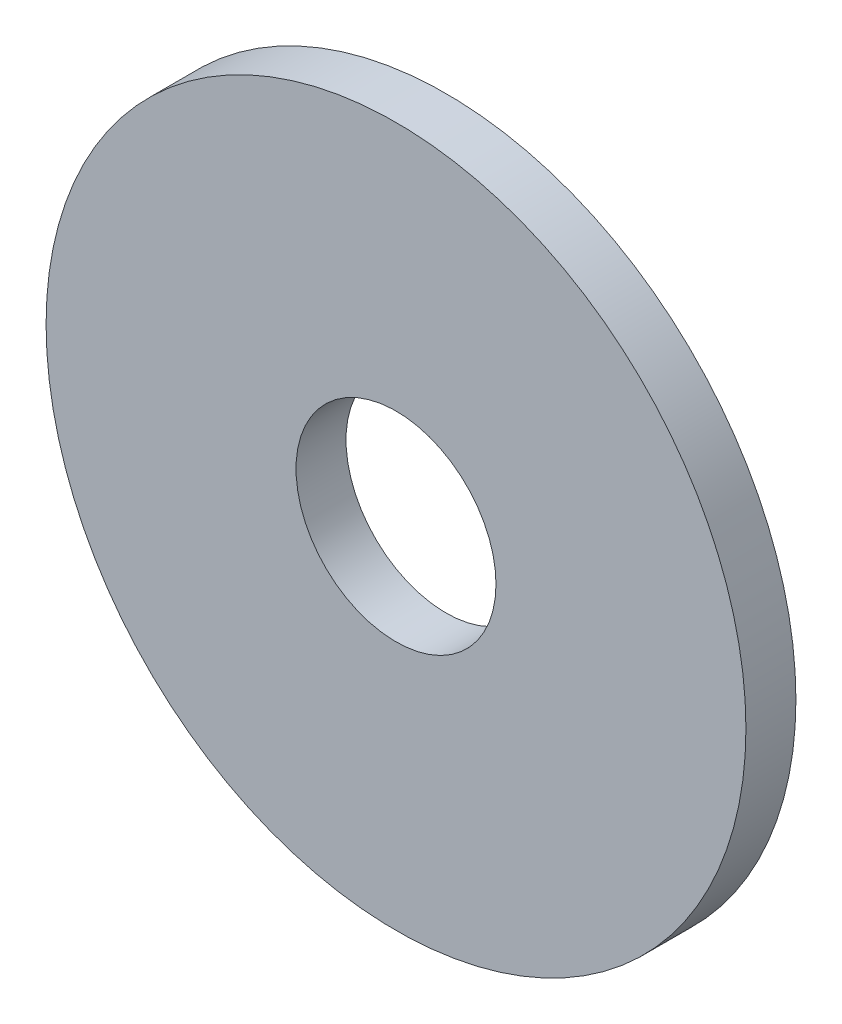
ISO-10303-21;
HEADER;
FILE_DESCRIPTION(('STEP AP214'),'2;1');
FILE_NAME('part.step','',(''),(''),'','','');
FILE_SCHEMA(('AUTOMOTIVE_DESIGN { 1 0 10303 214 1 1 1 1 }'));
ENDSEC;
DATA;
#1=APPLICATION_CONTEXT('core data for automotive mechanical design processes');
#2=APPLICATION_PROTOCOL_DEFINITION('international standard','automotive_design',2000,#1);
#3=PRODUCT_CONTEXT('',#1,'mechanical');
#4=PRODUCT('Part','Part','',(#3));
#5=PRODUCT_RELATED_PRODUCT_CATEGORY('part','',(#4));
#6=PRODUCT_DEFINITION_FORMATION('','',#4);
#7=PRODUCT_DEFINITION_CONTEXT('part definition',#1,'design');
#8=PRODUCT_DEFINITION('design','',#6,#7);
#9=PRODUCT_DEFINITION_SHAPE('','',#8);
#10=(LENGTH_UNIT() NAMED_UNIT(*) SI_UNIT(.MILLI.,.METRE.));
#11=(NAMED_UNIT(*) PLANE_ANGLE_UNIT() SI_UNIT($,.RADIAN.));
#12=(NAMED_UNIT(*) SI_UNIT($,.STERADIAN.) SOLID_ANGLE_UNIT());
#13=UNCERTAINTY_MEASURE_WITH_UNIT(LENGTH_MEASURE(1.E-05),#10,'distance_accuracy_value','');
#14=(GEOMETRIC_REPRESENTATION_CONTEXT(3) GLOBAL_UNCERTAINTY_ASSIGNED_CONTEXT((#13)) GLOBAL_UNIT_ASSIGNED_CONTEXT((#10,
#11,#12)) REPRESENTATION_CONTEXT('',''));
#15=CARTESIAN_POINT('',(0.,0.,0.));
#16=DIRECTION('',(0.,0.,1.));
#17=DIRECTION('',(1.,0.,0.));
#18=AXIS2_PLACEMENT_3D('',#15,#16,#17);
#19=CARTESIAN_POINT('',(0.,0.,1.));
#20=DIRECTION('',(0.,0.,1.));
#21=DIRECTION('',(1.,0.,0.));
#22=AXIS2_PLACEMENT_3D('',#19,#20,#21);
#23=PLANE('',#22);
#24=CARTESIAN_POINT('',(0.,0.,1.));
#25=DIRECTION('',(0.,0.,1.));
#26=DIRECTION('',(1.,0.,0.));
#27=AXIS2_PLACEMENT_3D('',#24,#25,#26);
#28=CIRCLE('',#27,7.);
#29=CARTESIAN_POINT('',(7.,0.,1.));
#30=VERTEX_POINT('',#29);
#31=EDGE_CURVE('E10',#30,#30,#28,.T.);
#32=ORIENTED_EDGE('',*,*,#31,.T.);
#33=EDGE_LOOP('',(#32));
#34=FACE_BOUND('',#33,.T.);
#35=CARTESIAN_POINT('',(0.,0.,1.));
#36=DIRECTION('',(0.,0.,1.));
#37=DIRECTION('',(1.,0.,0.));
#38=AXIS2_PLACEMENT_3D('',#35,#36,#37);
#39=CIRCLE('',#38,2.);
#40=CARTESIAN_POINT('',(2.,0.,1.));
#41=VERTEX_POINT('',#40);
#42=EDGE_CURVE('E42',#41,#41,#39,.T.);
#43=ORIENTED_EDGE('',*,*,#42,.F.);
#44=EDGE_LOOP('',(#43));
#45=FACE_BOUND('',#44,.T.);
#46=ADVANCED_FACE('F31',(#34,#45),#23,.T.);
#47=CARTESIAN_POINT('',(0.,0.,0.));
#48=DIRECTION('',(0.,0.,1.));
#49=DIRECTION('',(1.,0.,0.));
#50=AXIS2_PLACEMENT_3D('',#47,#48,#49);
#51=PLANE('',#50);
#52=CARTESIAN_POINT('',(0.,0.,0.));
#53=DIRECTION('',(0.,0.,1.));
#54=DIRECTION('',(1.,0.,0.));
#55=AXIS2_PLACEMENT_3D('',#52,#53,#54);
#56=CIRCLE('',#55,7.);
#57=CARTESIAN_POINT('',(7.,0.,0.));
#58=VERTEX_POINT('',#57);
#59=EDGE_CURVE('E35',#58,#58,#56,.T.);
#60=ORIENTED_EDGE('',*,*,#59,.F.);
#61=EDGE_LOOP('',(#60));
#62=FACE_BOUND('',#61,.T.);
#63=CARTESIAN_POINT('',(0.,0.,0.));
#64=DIRECTION('',(0.,0.,1.));
#65=DIRECTION('',(1.,0.,0.));
#66=AXIS2_PLACEMENT_3D('',#63,#64,#65);
#67=CIRCLE('',#66,2.);
#68=CARTESIAN_POINT('',(2.,0.,0.));
#69=VERTEX_POINT('',#68);
#70=EDGE_CURVE('E44',#69,#69,#67,.T.);
#71=ORIENTED_EDGE('',*,*,#70,.T.);
#72=EDGE_LOOP('',(#71));
#73=FACE_BOUND('',#72,.T.);
#74=ADVANCED_FACE('F54',(#62,#73),#51,.F.);
#75=CARTESIAN_POINT('',(0.,0.,1.));
#76=DIRECTION('',(0.,0.,-1.));
#77=DIRECTION('',(-1.,0.,0.));
#78=AXIS2_PLACEMENT_3D('',#75,#76,#77);
#79=CYLINDRICAL_SURFACE('',#78,7.);
#80=ORIENTED_EDGE('',*,*,#31,.F.);
#81=EDGE_LOOP('',(#80));
#82=FACE_BOUND('',#81,.T.);
#83=ORIENTED_EDGE('',*,*,#59,.T.);
#84=EDGE_LOOP('',(#83));
#85=FACE_BOUND('',#84,.T.);
#86=ADVANCED_FACE('F33',(#82,#85),#79,.T.);
#87=CARTESIAN_POINT('',(0.,0.,1.));
#88=DIRECTION('',(0.,0.,-1.));
#89=DIRECTION('',(-1.,0.,0.));
#90=AXIS2_PLACEMENT_3D('',#87,#88,#89);
#91=CYLINDRICAL_SURFACE('',#90,2.);
#92=ORIENTED_EDGE('',*,*,#42,.T.);
#93=EDGE_LOOP('',(#92));
#94=FACE_BOUND('',#93,.T.);
#95=ORIENTED_EDGE('',*,*,#70,.F.);
#96=EDGE_LOOP('',(#95));
#97=FACE_BOUND('',#96,.T.);
#98=ADVANCED_FACE('F50',(#94,#97),#91,.F.);
#99=CLOSED_SHELL('',(#46,#74,#86,#98));
#100=MANIFOLD_SOLID_BREP('B2',#99);
#101=ADVANCED_BREP_SHAPE_REPRESENTATION('',(#18,#100),#14);
#102=SHAPE_DEFINITION_REPRESENTATION(#9,#101);
ENDSEC;
END-ISO-10303-21;
